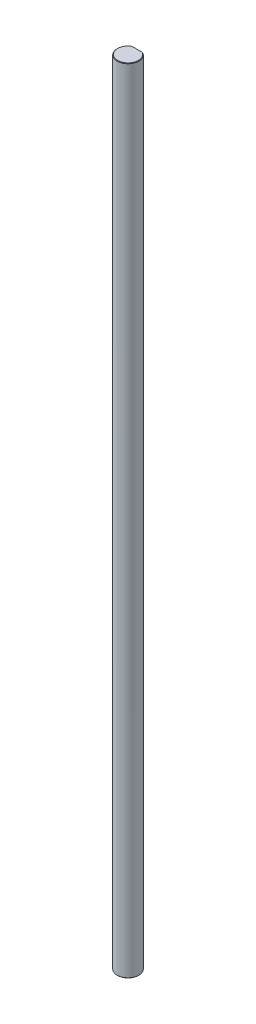
ISO-10303-21;
HEADER;
FILE_DESCRIPTION(('STEP AP214'),'2;1');
FILE_NAME('part.step','',(''),(''),'','','');
FILE_SCHEMA(('AUTOMOTIVE_DESIGN { 1 0 10303 214 1 1 1 1 }'));
ENDSEC;
DATA;
#1=APPLICATION_CONTEXT('core data for automotive mechanical design processes');
#2=APPLICATION_PROTOCOL_DEFINITION('international standard','automotive_design',2000,#1);
#3=PRODUCT_CONTEXT('',#1,'mechanical');
#4=PRODUCT('Part','Part','',(#3));
#5=PRODUCT_RELATED_PRODUCT_CATEGORY('part','',(#4));
#6=PRODUCT_DEFINITION_FORMATION('','',#4);
#7=PRODUCT_DEFINITION_CONTEXT('part definition',#1,'design');
#8=PRODUCT_DEFINITION('design','',#6,#7);
#9=PRODUCT_DEFINITION_SHAPE('','',#8);
#10=(LENGTH_UNIT() NAMED_UNIT(*) SI_UNIT(.MILLI.,.METRE.));
#11=(NAMED_UNIT(*) PLANE_ANGLE_UNIT() SI_UNIT($,.RADIAN.));
#12=(NAMED_UNIT(*) SI_UNIT($,.STERADIAN.) SOLID_ANGLE_UNIT());
#13=UNCERTAINTY_MEASURE_WITH_UNIT(LENGTH_MEASURE(1.E-05),#10,'distance_accuracy_value','');
#14=(GEOMETRIC_REPRESENTATION_CONTEXT(3) GLOBAL_UNCERTAINTY_ASSIGNED_CONTEXT((#13)) GLOBAL_UNIT_ASSIGNED_CONTEXT((#10,
#11,#12)) REPRESENTATION_CONTEXT('',''));
#15=CARTESIAN_POINT('',(0.,0.,0.));
#16=DIRECTION('',(0.,0.,1.));
#17=DIRECTION('',(1.,0.,0.));
#18=AXIS2_PLACEMENT_3D('',#15,#16,#17);
#19=CARTESIAN_POINT('',(0.,0.124999999999986,0.));
#20=DIRECTION('',(0.,1.,0.));
#21=DIRECTION('',(0.,0.,1.));
#22=AXIS2_PLACEMENT_3D('',#19,#20,#21);
#23=CONICAL_SURFACE('',#22,3.,0.785398163397438);
#24=CARTESIAN_POINT('',(0.,0.,0.));
#25=DIRECTION('',(0.,-1.,0.));
#26=DIRECTION('',(0.,0.,1.));
#27=AXIS2_PLACEMENT_3D('',#24,#25,#26);
#28=CIRCLE('',#27,2.875);
#29=CARTESIAN_POINT('',(0.,0.,2.875));
#30=VERTEX_POINT('',#29);
#31=CARTESIAN_POINT('',(-1.4197270864501,0.,-2.5));
#32=VERTEX_POINT('',#31);
#33=EDGE_CURVE('E40',#30,#32,#28,.T.);
#34=ORIENTED_EDGE('',*,*,#33,.F.);
#35=DIRECTION('',(0.,0.707106781186555,0.70710678118654));
#36=VECTOR('',#35,1.);
#37=CARTESIAN_POINT('',(0.,0.124999999999986,3.));
#38=LINE('',#37,#36);
#39=CARTESIAN_POINT('',(0.,0.124999999999986,3.));
#40=VERTEX_POINT('',#39);
#41=EDGE_CURVE('E10',#30,#40,#38,.T.);
#42=ORIENTED_EDGE('',*,*,#41,.T.);
#43=CARTESIAN_POINT('',(0.,0.124999999999986,0.));
#44=DIRECTION('',(0.,1.,0.));
#45=DIRECTION('',(0.,0.,1.));
#46=AXIS2_PLACEMENT_3D('',#43,#44,#45);
#47=CIRCLE('',#46,3.);
#48=CARTESIAN_POINT('',(-1.6583123951777,0.124999999999986,-2.5));
#49=VERTEX_POINT('',#48);
#50=EDGE_CURVE('E127',#49,#40,#47,.T.);
#51=ORIENTED_EDGE('',*,*,#50,.F.);
#52=CARTESIAN_POINT('',(-1.4197270864501,0.,-2.5));
#53=CARTESIAN_POINT('',(-1.50022900034241,0.0397533035352969,-2.5));
#54=CARTESIAN_POINT('',(-1.57973572193477,0.0815651095964451,-2.5));
#55=CARTESIAN_POINT('',(-1.6583123951777,0.124999999999986,-2.5));
#56=(BOUNDED_CURVE() B_SPLINE_CURVE(3,(#52,#53,#54,#55),.UNSPECIFIED.,.F.,
.F.) B_SPLINE_CURVE_WITH_KNOTS((4,4),(0.,0.000269347265701063),
.UNSPECIFIED.) CURVE() GEOMETRIC_REPRESENTATION_ITEM() RATIONAL_B_SPLINE_CURVE((1.,1.,1.,1.)) REPRESENTATION_ITEM(''));
#57=EDGE_CURVE('E121',#32,#49,#56,.T.);
#58=ORIENTED_EDGE('',*,*,#57,.F.);
#59=EDGE_LOOP('',(#34,#42,#51,#58));
#60=FACE_BOUND('',#59,.T.);
#61=ADVANCED_FACE('F16',(#60),#23,.T.);
#62=CARTESIAN_POINT('',(0.,220.,0.));
#63=DIRECTION('',(0.,-1.,0.));
#64=DIRECTION('',(0.,0.,-1.));
#65=AXIS2_PLACEMENT_3D('',#62,#63,#64);
#66=CYLINDRICAL_SURFACE('',#65,3.);
#67=DIRECTION('',(0.,-1.,0.));
#68=VECTOR('',#67,1.);
#69=CARTESIAN_POINT('',(-1.6583123951777,220.,-2.5));
#70=LINE('',#69,#68);
#71=CARTESIAN_POINT('',(-1.6583123951777,219.875,-2.5));
#72=VERTEX_POINT('',#71);
#73=EDGE_CURVE('E26',#72,#49,#70,.T.);
#74=ORIENTED_EDGE('',*,*,#73,.T.);
#75=ORIENTED_EDGE('',*,*,#50,.T.);
#76=CARTESIAN_POINT('',(0.,0.124999999999986,0.));
#77=DIRECTION('',(0.,1.,0.));
#78=DIRECTION('',(0.,0.,1.));
#79=AXIS2_PLACEMENT_3D('',#76,#77,#78);
#80=CIRCLE('',#79,3.);
#81=CARTESIAN_POINT('',(1.6583123951777,0.124999999999986,-2.5));
#82=VERTEX_POINT('',#81);
#83=EDGE_CURVE('E133',#40,#82,#80,.T.);
#84=ORIENTED_EDGE('',*,*,#83,.T.);
#85=DIRECTION('',(0.,-1.,0.));
#86=VECTOR('',#85,1.);
#87=CARTESIAN_POINT('',(1.6583123951777,220.,-2.5));
#88=LINE('',#87,#86);
#89=CARTESIAN_POINT('',(1.6583123951777,219.875,-2.5));
#90=VERTEX_POINT('',#89);
#91=EDGE_CURVE('E67',#90,#82,#88,.T.);
#92=ORIENTED_EDGE('',*,*,#91,.F.);
#93=CARTESIAN_POINT('',(0.,219.875,0.));
#94=DIRECTION('',(0.,-1.,0.));
#95=DIRECTION('',(0.,0.,1.));
#96=AXIS2_PLACEMENT_3D('',#93,#94,#95);
#97=CIRCLE('',#96,3.);
#98=EDGE_CURVE('E75',#90,#72,#97,.T.);
#99=ORIENTED_EDGE('',*,*,#98,.T.);
#100=EDGE_LOOP('',(#74,#75,#84,#92,#99));
#101=FACE_BOUND('',#100,.T.);
#102=ADVANCED_FACE('F159',(#101),#66,.T.);
#103=CARTESIAN_POINT('',(0.,220.,-2.5));
#104=DIRECTION('',(0.,0.,-1.));
#105=DIRECTION('',(0.,-1.,0.));
#106=AXIS2_PLACEMENT_3D('',#103,#104,#105);
#107=PLANE('',#106);
#108=ORIENTED_EDGE('',*,*,#91,.T.);
#109=CARTESIAN_POINT('',(1.6583123951777,0.124999999999986,-2.5));
#110=CARTESIAN_POINT('',(1.57973572193477,0.0815651095964574,-2.5));
#111=CARTESIAN_POINT('',(1.50022900034242,0.0397533035352731,-2.5));
#112=CARTESIAN_POINT('',(1.4197270864501,0.,-2.5));
#113=(BOUNDED_CURVE() B_SPLINE_CURVE(3,(#109,#110,#111,#112),.UNSPECIFIED.,.F.,
.F.) B_SPLINE_CURVE_WITH_KNOTS((4,4),(0.,0.000269347265701064),
.UNSPECIFIED.) CURVE() GEOMETRIC_REPRESENTATION_ITEM() RATIONAL_B_SPLINE_CURVE((1.,1.,1.,1.)) REPRESENTATION_ITEM(''));
#114=CARTESIAN_POINT('',(1.4197270864501,0.,-2.5));
#115=VERTEX_POINT('',#114);
#116=EDGE_CURVE('E126',#82,#115,#113,.T.);
#117=ORIENTED_EDGE('',*,*,#116,.T.);
#118=DIRECTION('',(1.,0.,0.));
#119=VECTOR('',#118,1.);
#120=CARTESIAN_POINT('',(0.,0.,-2.5));
#121=LINE('',#120,#119);
#122=EDGE_CURVE('E106',#32,#115,#121,.T.);
#123=ORIENTED_EDGE('',*,*,#122,.F.);
#124=ORIENTED_EDGE('',*,*,#57,.T.);
#125=ORIENTED_EDGE('',*,*,#73,.F.);
#126=CARTESIAN_POINT('',(-1.6583123951777,219.875,-2.5));
#127=CARTESIAN_POINT('',(-1.57973572193477,219.918434890403,-2.5));
#128=CARTESIAN_POINT('',(-1.50022900034242,219.960246696465,-2.5));
#129=CARTESIAN_POINT('',(-1.4197270864501,220.,-2.5));
#130=(BOUNDED_CURVE() B_SPLINE_CURVE(3,(#126,#127,#128,#129),.UNSPECIFIED.,.F.,
.F.) B_SPLINE_CURVE_WITH_KNOTS((4,4),(0.,0.000269347265701066),
.UNSPECIFIED.) CURVE() GEOMETRIC_REPRESENTATION_ITEM() RATIONAL_B_SPLINE_CURVE((1.,1.,1.,1.)) REPRESENTATION_ITEM(''));
#131=CARTESIAN_POINT('',(-1.4197270864501,220.,-2.5));
#132=VERTEX_POINT('',#131);
#133=EDGE_CURVE('E102',#72,#132,#130,.T.);
#134=ORIENTED_EDGE('',*,*,#133,.T.);
#135=DIRECTION('',(1.,0.,0.));
#136=VECTOR('',#135,1.);
#137=CARTESIAN_POINT('',(0.,220.,-2.5));
#138=LINE('',#137,#136);
#139=CARTESIAN_POINT('',(1.4197270864501,220.,-2.5));
#140=VERTEX_POINT('',#139);
#141=EDGE_CURVE('E19',#132,#140,#138,.T.);
#142=ORIENTED_EDGE('',*,*,#141,.T.);
#143=CARTESIAN_POINT('',(1.4197270864501,220.,-2.5));
#144=CARTESIAN_POINT('',(1.50022900034241,219.960246696465,-2.5));
#145=CARTESIAN_POINT('',(1.57973572193477,219.918434890403,-2.5));
#146=CARTESIAN_POINT('',(1.6583123951777,219.875,-2.5));
#147=(BOUNDED_CURVE() B_SPLINE_CURVE(3,(#143,#144,#145,#146),.UNSPECIFIED.,.F.,
.F.) B_SPLINE_CURVE_WITH_KNOTS((4,4),(0.,0.000269347265701066),
.UNSPECIFIED.) CURVE() GEOMETRIC_REPRESENTATION_ITEM() RATIONAL_B_SPLINE_CURVE((1.,1.,1.,1.)) REPRESENTATION_ITEM(''));
#148=EDGE_CURVE('E94',#140,#90,#147,.T.);
#149=ORIENTED_EDGE('',*,*,#148,.T.);
#150=EDGE_LOOP('',(#108,#117,#123,#124,#125,#134,#142,#149));
#151=FACE_BOUND('',#150,.T.);
#152=ADVANCED_FACE('F101',(#151),#107,.T.);
#153=CARTESIAN_POINT('',(0.,220.,0.));
#154=DIRECTION('',(0.,1.,0.));
#155=DIRECTION('',(1.,0.,0.));
#156=AXIS2_PLACEMENT_3D('',#153,#154,#155);
#157=PLANE('',#156);
#158=ORIENTED_EDGE('',*,*,#141,.F.);
#159=CARTESIAN_POINT('',(0.,220.,0.));
#160=DIRECTION('',(0.,1.,0.));
#161=DIRECTION('',(0.,0.,1.));
#162=AXIS2_PLACEMENT_3D('',#159,#160,#161);
#163=CIRCLE('',#162,2.875);
#164=EDGE_CURVE('E97',#132,#140,#163,.T.);
#165=ORIENTED_EDGE('',*,*,#164,.T.);
#166=EDGE_LOOP('',(#158,#165));
#167=FACE_BOUND('',#166,.T.);
#168=ADVANCED_FACE('F104',(#167),#157,.T.);
#169=CARTESIAN_POINT('',(0.,0.,0.));
#170=DIRECTION('',(0.,1.,0.));
#171=DIRECTION('',(1.,0.,0.));
#172=AXIS2_PLACEMENT_3D('',#169,#170,#171);
#173=PLANE('',#172);
#174=ORIENTED_EDGE('',*,*,#122,.T.);
#175=CARTESIAN_POINT('',(0.,0.,0.));
#176=DIRECTION('',(0.,-1.,0.));
#177=DIRECTION('',(0.,0.,1.));
#178=AXIS2_PLACEMENT_3D('',#175,#176,#177);
#179=CIRCLE('',#178,2.875);
#180=EDGE_CURVE('E113',#115,#30,#179,.T.);
#181=ORIENTED_EDGE('',*,*,#180,.T.);
#182=ORIENTED_EDGE('',*,*,#33,.T.);
#183=EDGE_LOOP('',(#174,#181,#182));
#184=FACE_BOUND('',#183,.T.);
#185=ADVANCED_FACE('F164',(#184),#173,.F.);
#186=CARTESIAN_POINT('',(0.,0.124999999999986,0.));
#187=DIRECTION('',(0.,1.,0.));
#188=DIRECTION('',(0.,0.,1.));
#189=AXIS2_PLACEMENT_3D('',#186,#187,#188);
#190=CONICAL_SURFACE('',#189,3.,0.785398163397438);
#191=ORIENTED_EDGE('',*,*,#41,.F.);
#192=ORIENTED_EDGE('',*,*,#180,.F.);
#193=ORIENTED_EDGE('',*,*,#116,.F.);
#194=ORIENTED_EDGE('',*,*,#83,.F.);
#195=EDGE_LOOP('',(#191,#192,#193,#194));
#196=FACE_BOUND('',#195,.T.);
#197=ADVANCED_FACE('F162',(#196),#190,.T.);
#198=CARTESIAN_POINT('',(0.,220.,0.));
#199=DIRECTION('',(0.,-1.,0.));
#200=DIRECTION('',(0.,0.,-1.));
#201=AXIS2_PLACEMENT_3D('',#198,#199,#200);
#202=CONICAL_SURFACE('',#201,2.875,0.78539816339744);
#203=ORIENTED_EDGE('',*,*,#133,.F.);
#204=ORIENTED_EDGE('',*,*,#98,.F.);
#205=ORIENTED_EDGE('',*,*,#148,.F.);
#206=ORIENTED_EDGE('',*,*,#164,.F.);
#207=EDGE_LOOP('',(#203,#204,#205,#206));
#208=FACE_BOUND('',#207,.T.);
#209=ADVANCED_FACE('F96',(#208),#202,.T.);
#210=CLOSED_SHELL('',(#61,#102,#152,#168,#185,#197,#209));
#211=MANIFOLD_SOLID_BREP('B1',#210);
#212=ADVANCED_BREP_SHAPE_REPRESENTATION('',(#18,#211),#14);
#213=SHAPE_DEFINITION_REPRESENTATION(#9,#212);
ENDSEC;
END-ISO-10303-21;
